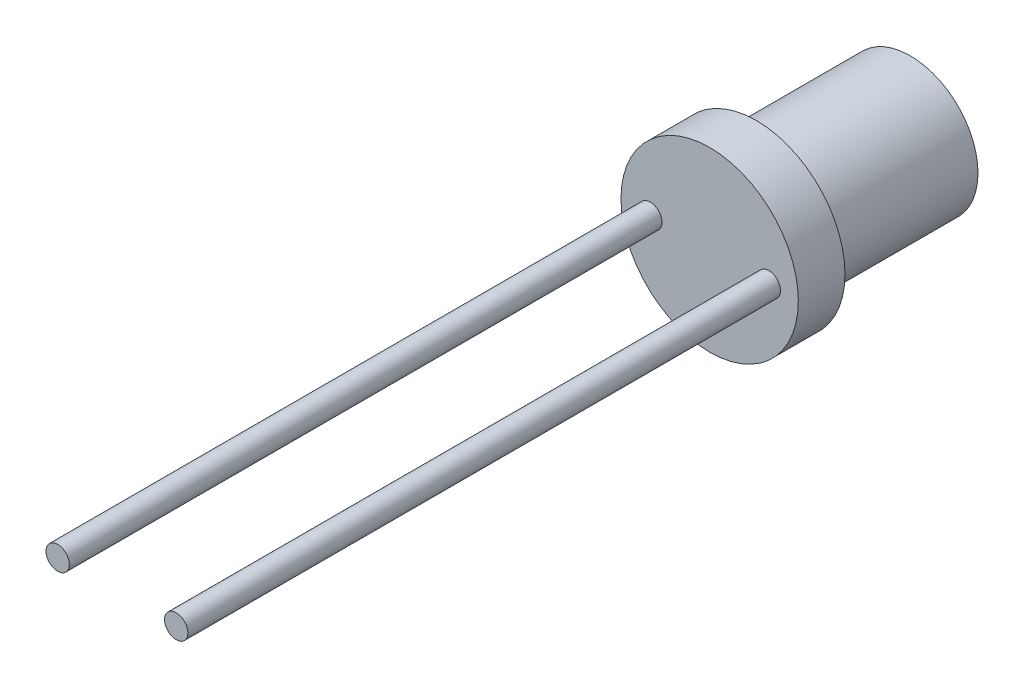
ISO-10303-21;
HEADER;
FILE_DESCRIPTION(('STEP AP214'),'2;1');
FILE_NAME('part.step','',(''),(''),'','','');
FILE_SCHEMA(('AUTOMOTIVE_DESIGN { 1 0 10303 214 1 1 1 1 }'));
ENDSEC;
DATA;
#1=APPLICATION_CONTEXT('core data for automotive mechanical design processes');
#2=APPLICATION_PROTOCOL_DEFINITION('international standard','automotive_design',2000,#1);
#3=PRODUCT_CONTEXT('',#1,'mechanical');
#4=PRODUCT('Part','Part','',(#3));
#5=PRODUCT_RELATED_PRODUCT_CATEGORY('part','',(#4));
#6=PRODUCT_DEFINITION_FORMATION('','',#4);
#7=PRODUCT_DEFINITION_CONTEXT('part definition',#1,'design');
#8=PRODUCT_DEFINITION('design','',#6,#7);
#9=PRODUCT_DEFINITION_SHAPE('','',#8);
#10=(LENGTH_UNIT() NAMED_UNIT(*) SI_UNIT(.MILLI.,.METRE.));
#11=(NAMED_UNIT(*) PLANE_ANGLE_UNIT() SI_UNIT($,.RADIAN.));
#12=(NAMED_UNIT(*) SI_UNIT($,.STERADIAN.) SOLID_ANGLE_UNIT());
#13=UNCERTAINTY_MEASURE_WITH_UNIT(LENGTH_MEASURE(1.E-05),#10,'distance_accuracy_value','');
#14=(GEOMETRIC_REPRESENTATION_CONTEXT(3) GLOBAL_UNCERTAINTY_ASSIGNED_CONTEXT((#13)) GLOBAL_UNIT_ASSIGNED_CONTEXT((#10,
#11,#12)) REPRESENTATION_CONTEXT('',''));
#15=CARTESIAN_POINT('',(0.,0.,0.));
#16=DIRECTION('',(0.,0.,1.));
#17=DIRECTION('',(1.,0.,0.));
#18=AXIS2_PLACEMENT_3D('',#15,#16,#17);
#19=CARTESIAN_POINT('',(0.,0.,4.3));
#20=DIRECTION('',(0.,0.,1.));
#21=DIRECTION('',(1.,0.,0.));
#22=AXIS2_PLACEMENT_3D('',#19,#20,#21);
#23=PLANE('',#22);
#24=CARTESIAN_POINT('',(-1.27,0.,4.3));
#25=DIRECTION('',(0.,0.,1.));
#26=DIRECTION('',(1.,0.,0.));
#27=AXIS2_PLACEMENT_3D('',#24,#25,#26);
#28=CIRCLE('',#27,0.25);
#29=CARTESIAN_POINT('',(-1.02,0.,4.3));
#30=VERTEX_POINT('',#29);
#31=EDGE_CURVE('E56',#30,#30,#28,.T.);
#32=ORIENTED_EDGE('',*,*,#31,.F.);
#33=EDGE_LOOP('',(#32));
#34=FACE_BOUND('',#33,.T.);
#35=CARTESIAN_POINT('',(0.,0.,4.3));
#36=DIRECTION('',(0.,0.,1.));
#37=DIRECTION('',(1.,0.,0.));
#38=AXIS2_PLACEMENT_3D('',#35,#36,#37);
#39=CIRCLE('',#38,1.9);
#40=CARTESIAN_POINT('',(1.9,0.,4.3));
#41=VERTEX_POINT('',#40);
#42=EDGE_CURVE('E44',#41,#41,#39,.T.);
#43=ORIENTED_EDGE('',*,*,#42,.T.);
#44=EDGE_LOOP('',(#43));
#45=FACE_BOUND('',#44,.T.);
#46=CARTESIAN_POINT('',(1.27,0.,4.3));
#47=DIRECTION('',(0.,0.,1.));
#48=DIRECTION('',(-1.,0.,0.));
#49=AXIS2_PLACEMENT_3D('',#46,#47,#48);
#50=CIRCLE('',#49,0.25);
#51=CARTESIAN_POINT('',(1.02,0.,4.3));
#52=VERTEX_POINT('',#51);
#53=EDGE_CURVE('E62',#52,#52,#50,.T.);
#54=ORIENTED_EDGE('',*,*,#53,.F.);
#55=EDGE_LOOP('',(#54));
#56=FACE_BOUND('',#55,.T.);
#57=ADVANCED_FACE('F33',(#34,#45,#56),#23,.T.);
#58=CARTESIAN_POINT('',(0.,0.,3.3));
#59=DIRECTION('',(0.,0.,-1.));
#60=DIRECTION('',(-1.,0.,0.));
#61=AXIS2_PLACEMENT_3D('',#58,#59,#60);
#62=CYLINDRICAL_SURFACE('',#61,1.45);
#63=CARTESIAN_POINT('',(0.,0.,3.3));
#64=DIRECTION('',(0.,0.,1.));
#65=DIRECTION('',(1.,0.,0.));
#66=AXIS2_PLACEMENT_3D('',#63,#64,#65);
#67=CIRCLE('',#66,1.45);
#68=CARTESIAN_POINT('',(1.45,0.,3.3));
#69=VERTEX_POINT('',#68);
#70=EDGE_CURVE('E10',#69,#69,#67,.T.);
#71=ORIENTED_EDGE('',*,*,#70,.F.);
#72=EDGE_LOOP('',(#71));
#73=FACE_BOUND('',#72,.T.);
#74=CARTESIAN_POINT('',(0.,0.,0.));
#75=DIRECTION('',(0.,0.,1.));
#76=DIRECTION('',(1.,0.,0.));
#77=AXIS2_PLACEMENT_3D('',#74,#75,#76);
#78=CIRCLE('',#77,1.45);
#79=CARTESIAN_POINT('',(1.45,0.,0.));
#80=VERTEX_POINT('',#79);
#81=EDGE_CURVE('E40',#80,#80,#78,.T.);
#82=ORIENTED_EDGE('',*,*,#81,.T.);
#83=EDGE_LOOP('',(#82));
#84=FACE_BOUND('',#83,.T.);
#85=ADVANCED_FACE('F35',(#73,#84),#62,.T.);
#86=CARTESIAN_POINT('',(0.,0.,0.));
#87=DIRECTION('',(0.,0.,1.));
#88=DIRECTION('',(1.,0.,0.));
#89=AXIS2_PLACEMENT_3D('',#86,#87,#88);
#90=PLANE('',#89);
#91=ORIENTED_EDGE('',*,*,#81,.F.);
#92=EDGE_LOOP('',(#91));
#93=FACE_BOUND('',#92,.T.);
#94=ADVANCED_FACE('F74',(#93),#90,.F.);
#95=CARTESIAN_POINT('',(0.,0.,3.3));
#96=DIRECTION('',(0.,0.,1.));
#97=DIRECTION('',(1.,0.,0.));
#98=AXIS2_PLACEMENT_3D('',#95,#96,#97);
#99=PLANE('',#98);
#100=CARTESIAN_POINT('',(0.,0.,3.3));
#101=DIRECTION('',(0.,0.,1.));
#102=DIRECTION('',(1.,0.,0.));
#103=AXIS2_PLACEMENT_3D('',#100,#101,#102);
#104=CIRCLE('',#103,1.9);
#105=CARTESIAN_POINT('',(1.9,0.,3.3));
#106=VERTEX_POINT('',#105);
#107=EDGE_CURVE('E48',#106,#106,#104,.T.);
#108=ORIENTED_EDGE('',*,*,#107,.F.);
#109=EDGE_LOOP('',(#108));
#110=FACE_BOUND('',#109,.T.);
#111=ORIENTED_EDGE('',*,*,#70,.T.);
#112=EDGE_LOOP('',(#111));
#113=FACE_BOUND('',#112,.T.);
#114=ADVANCED_FACE('F80',(#110,#113),#99,.F.);
#115=CARTESIAN_POINT('',(0.,0.,4.3));
#116=DIRECTION('',(0.,0.,-1.));
#117=DIRECTION('',(-1.,0.,0.));
#118=AXIS2_PLACEMENT_3D('',#115,#116,#117);
#119=CYLINDRICAL_SURFACE('',#118,1.9);
#120=ORIENTED_EDGE('',*,*,#42,.F.);
#121=EDGE_LOOP('',(#120));
#122=FACE_BOUND('',#121,.T.);
#123=ORIENTED_EDGE('',*,*,#107,.T.);
#124=EDGE_LOOP('',(#123));
#125=FACE_BOUND('',#124,.T.);
#126=ADVANCED_FACE('F82',(#122,#125),#119,.T.);
#127=CARTESIAN_POINT('',(-1.27,0.,17.));
#128=DIRECTION('',(0.,0.,-1.));
#129=DIRECTION('',(-1.,0.,0.));
#130=AXIS2_PLACEMENT_3D('',#127,#128,#129);
#131=CYLINDRICAL_SURFACE('',#130,0.25);
#132=CARTESIAN_POINT('',(-1.27,0.,17.));
#133=DIRECTION('',(0.,0.,1.));
#134=DIRECTION('',(1.,0.,0.));
#135=AXIS2_PLACEMENT_3D('',#132,#133,#134);
#136=CIRCLE('',#135,0.25);
#137=CARTESIAN_POINT('',(-1.02,0.,17.));
#138=VERTEX_POINT('',#137);
#139=EDGE_CURVE('E53',#138,#138,#136,.T.);
#140=ORIENTED_EDGE('',*,*,#139,.F.);
#141=EDGE_LOOP('',(#140));
#142=FACE_BOUND('',#141,.T.);
#143=ORIENTED_EDGE('',*,*,#31,.T.);
#144=EDGE_LOOP('',(#143));
#145=FACE_BOUND('',#144,.T.);
#146=ADVANCED_FACE('F84',(#142,#145),#131,.T.);
#147=CARTESIAN_POINT('',(-1.27,0.,17.));
#148=DIRECTION('',(0.,0.,1.));
#149=DIRECTION('',(1.,0.,0.));
#150=AXIS2_PLACEMENT_3D('',#147,#148,#149);
#151=PLANE('',#150);
#152=ORIENTED_EDGE('',*,*,#139,.T.);
#153=EDGE_LOOP('',(#152));
#154=FACE_BOUND('',#153,.T.);
#155=ADVANCED_FACE('F107',(#154),#151,.T.);
#156=CARTESIAN_POINT('',(1.27,0.,17.));
#157=DIRECTION('',(0.,0.,-1.));
#158=DIRECTION('',(-1.,0.,0.));
#159=AXIS2_PLACEMENT_3D('',#156,#157,#158);
#160=CYLINDRICAL_SURFACE('',#159,0.25);
#161=CARTESIAN_POINT('',(1.27,0.,17.));
#162=DIRECTION('',(0.,0.,1.));
#163=DIRECTION('',(-1.,0.,0.));
#164=AXIS2_PLACEMENT_3D('',#161,#162,#163);
#165=CIRCLE('',#164,0.25);
#166=CARTESIAN_POINT('',(1.02,0.,17.));
#167=VERTEX_POINT('',#166);
#168=EDGE_CURVE('E59',#167,#167,#165,.T.);
#169=ORIENTED_EDGE('',*,*,#168,.F.);
#170=EDGE_LOOP('',(#169));
#171=FACE_BOUND('',#170,.T.);
#172=ORIENTED_EDGE('',*,*,#53,.T.);
#173=EDGE_LOOP('',(#172));
#174=FACE_BOUND('',#173,.T.);
#175=ADVANCED_FACE('F66',(#171,#174),#160,.T.);
#176=CARTESIAN_POINT('',(1.27,0.,17.));
#177=DIRECTION('',(0.,0.,-1.));
#178=DIRECTION('',(-1.,0.,0.));
#179=AXIS2_PLACEMENT_3D('',#176,#177,#178);
#180=PLANE('',#179);
#181=ORIENTED_EDGE('',*,*,#168,.T.);
#182=EDGE_LOOP('',(#181));
#183=FACE_BOUND('',#182,.T.);
#184=ADVANCED_FACE('F121',(#183),#180,.F.);
#185=CLOSED_SHELL('',(#57,#85,#94,#114,#126,#146,#155,#175,#184));
#186=MANIFOLD_SOLID_BREP('B2',#185);
#187=ADVANCED_BREP_SHAPE_REPRESENTATION('',(#18,#186),#14);
#188=SHAPE_DEFINITION_REPRESENTATION(#9,#187);
ENDSEC;
END-ISO-10303-21;
